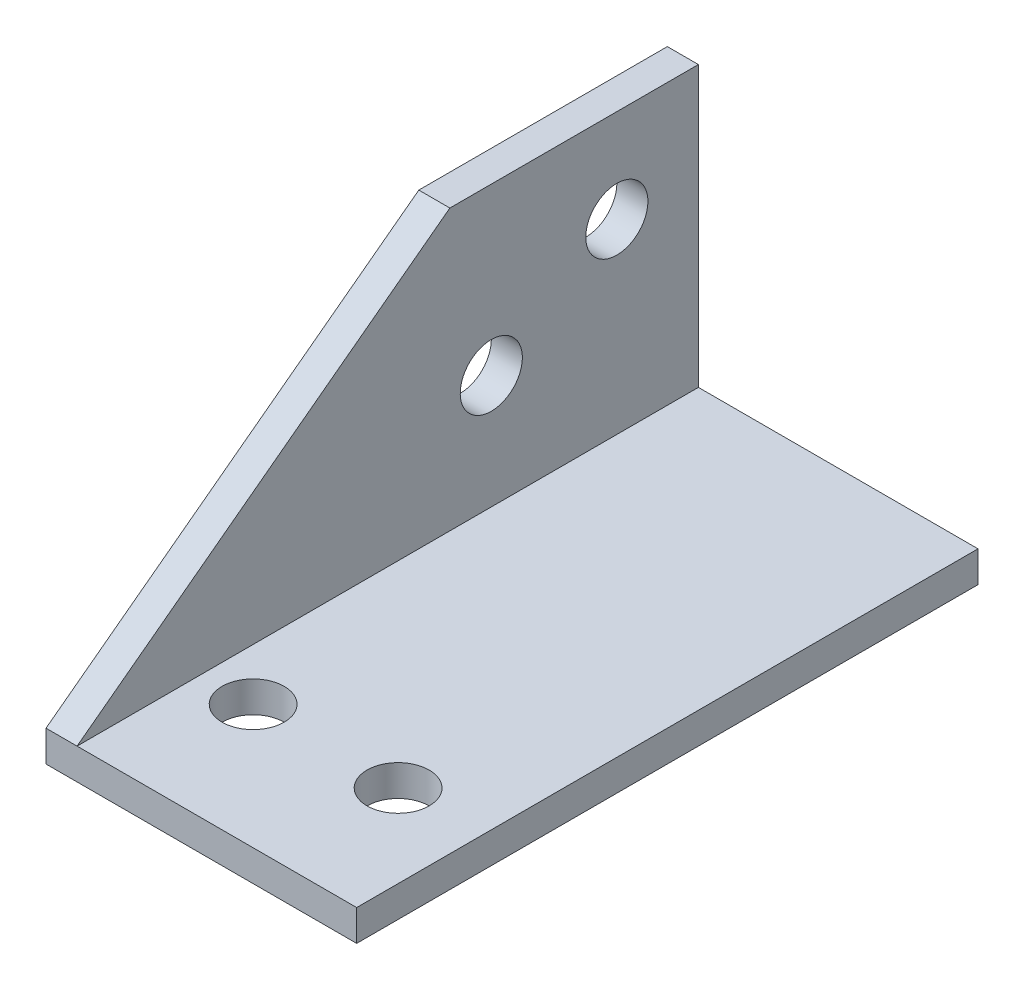
ISO-10303-21;
HEADER;
FILE_DESCRIPTION(('STEP AP214'),'2;1');
FILE_NAME('part.step','',(''),(''),'','','');
FILE_SCHEMA(('AUTOMOTIVE_DESIGN { 1 0 10303 214 1 1 1 1 }'));
ENDSEC;
DATA;
#1=APPLICATION_CONTEXT('core data for automotive mechanical design processes');
#2=APPLICATION_PROTOCOL_DEFINITION('international standard','automotive_design',2000,#1);
#3=PRODUCT_CONTEXT('',#1,'mechanical');
#4=PRODUCT('Part','Part','',(#3));
#5=PRODUCT_RELATED_PRODUCT_CATEGORY('part','',(#4));
#6=PRODUCT_DEFINITION_FORMATION('','',#4);
#7=PRODUCT_DEFINITION_CONTEXT('part definition',#1,'design');
#8=PRODUCT_DEFINITION('design','',#6,#7);
#9=PRODUCT_DEFINITION_SHAPE('','',#8);
#10=(LENGTH_UNIT() NAMED_UNIT(*) SI_UNIT(.MILLI.,.METRE.));
#11=(NAMED_UNIT(*) PLANE_ANGLE_UNIT() SI_UNIT($,.RADIAN.));
#12=(NAMED_UNIT(*) SI_UNIT($,.STERADIAN.) SOLID_ANGLE_UNIT());
#13=UNCERTAINTY_MEASURE_WITH_UNIT(LENGTH_MEASURE(1.E-05),#10,'distance_accuracy_value','');
#14=(GEOMETRIC_REPRESENTATION_CONTEXT(3) GLOBAL_UNCERTAINTY_ASSIGNED_CONTEXT((#13)) GLOBAL_UNIT_ASSIGNED_CONTEXT((#10,
#11,#12)) REPRESENTATION_CONTEXT('',''));
#15=CARTESIAN_POINT('',(0.,0.,0.));
#16=DIRECTION('',(0.,0.,1.));
#17=DIRECTION('',(1.,0.,0.));
#18=AXIS2_PLACEMENT_3D('',#15,#16,#17);
#19=CARTESIAN_POINT('',(-13.9999495377305,-12.8175789473684,30.));
#20=DIRECTION('',(-1.,0.,0.));
#21=DIRECTION('',(0.,-1.,0.));
#22=AXIS2_PLACEMENT_3D('',#19,#20,#21);
#23=PLANE('',#22);
#24=CARTESIAN_POINT('',(-13.9999495377305,-3.81757894736842,3.93782217350893));
#25=DIRECTION('',(1.,0.,0.));
#26=DIRECTION('',(0.,1.,0.));
#27=AXIS2_PLACEMENT_3D('',#24,#25,#26);
#28=CIRCLE('',#27,1.5);
#29=CARTESIAN_POINT('',(-13.9999495377305,-2.31757894736842,3.93782217350893));
#30=VERTEX_POINT('',#29);
#31=EDGE_CURVE('E128',#30,#30,#28,.T.);
#32=ORIENTED_EDGE('',*,*,#31,.F.);
#33=EDGE_LOOP('',(#32));
#34=FACE_BOUND('',#33,.T.);
#35=CARTESIAN_POINT('',(-13.9999495377305,-7.31757894736842,10.));
#36=DIRECTION('',(1.,0.,0.));
#37=DIRECTION('',(0.,1.,0.));
#38=AXIS2_PLACEMENT_3D('',#35,#36,#37);
#39=CIRCLE('',#38,1.5);
#40=CARTESIAN_POINT('',(-13.9999495377305,-5.81757894736842,10.));
#41=VERTEX_POINT('',#40);
#42=EDGE_CURVE('E125',#41,#41,#39,.T.);
#43=ORIENTED_EDGE('',*,*,#42,.F.);
#44=EDGE_LOOP('',(#43));
#45=FACE_BOUND('',#44,.T.);
#46=DIRECTION('',(0.,0.,-1.));
#47=VECTOR('',#46,1.);
#48=CARTESIAN_POINT('',(-13.9999495377305,0.682421052631582,30.));
#49=LINE('',#48,#47);
#50=CARTESIAN_POINT('',(-13.9999495377305,0.682421052631582,12.));
#51=VERTEX_POINT('',#50);
#52=CARTESIAN_POINT('',(-13.9999495377305,0.682421052631582,0.));
#53=VERTEX_POINT('',#52);
#54=EDGE_CURVE('E37',#51,#53,#49,.T.);
#55=ORIENTED_EDGE('',*,*,#54,.F.);
#56=DIRECTION('',(0.,0.6,-0.8));
#57=VECTOR('',#56,1.);
#58=CARTESIAN_POINT('',(-13.9999495377305,-12.8175789473684,30.));
#59=LINE('',#58,#57);
#60=CARTESIAN_POINT('',(-13.9999495377305,-12.8175789473684,30.));
#61=VERTEX_POINT('',#60);
#62=EDGE_CURVE('E93',#61,#51,#59,.T.);
#63=ORIENTED_EDGE('',*,*,#62,.F.);
#64=DIRECTION('',(0.,0.,-1.));
#65=VECTOR('',#64,1.);
#66=CARTESIAN_POINT('',(-13.9999495377305,-12.8175789473684,30.));
#67=LINE('',#66,#65);
#68=CARTESIAN_POINT('',(-13.9999495377305,-12.8175789473684,0.));
#69=VERTEX_POINT('',#68);
#70=EDGE_CURVE('E98',#61,#69,#67,.T.);
#71=ORIENTED_EDGE('',*,*,#70,.T.);
#72=DIRECTION('',(0.,1.,0.));
#73=VECTOR('',#72,1.);
#74=CARTESIAN_POINT('',(-13.9999495377305,-12.8175789473684,0.));
#75=LINE('',#74,#73);
#76=EDGE_CURVE('E151',#69,#53,#75,.T.);
#77=ORIENTED_EDGE('',*,*,#76,.T.);
#78=EDGE_LOOP('',(#55,#63,#71,#77));
#79=FACE_BOUND('',#78,.T.);
#80=ADVANCED_FACE('F30',(#34,#45,#79),#23,.F.);
#81=CARTESIAN_POINT('',(-13.9999495377305,0.682421052631582,30.));
#82=DIRECTION('',(0.,-1.,0.));
#83=DIRECTION('',(0.,0.,-1.));
#84=AXIS2_PLACEMENT_3D('',#81,#82,#83);
#85=PLANE('',#84);
#86=DIRECTION('',(0.,0.,-1.));
#87=VECTOR('',#86,1.);
#88=CARTESIAN_POINT('',(-15.4999495377305,0.682421052631582,30.));
#89=LINE('',#88,#87);
#90=CARTESIAN_POINT('',(-15.4999495377305,0.682421052631582,12.));
#91=VERTEX_POINT('',#90);
#92=CARTESIAN_POINT('',(-15.4999495377305,0.682421052631582,0.));
#93=VERTEX_POINT('',#92);
#94=EDGE_CURVE('E119',#91,#93,#89,.T.);
#95=ORIENTED_EDGE('',*,*,#94,.F.);
#96=DIRECTION('',(1.,0.,0.));
#97=VECTOR('',#96,1.);
#98=CARTESIAN_POINT('',(-63.9999495377305,0.682421052631587,12.));
#99=LINE('',#98,#97);
#100=EDGE_CURVE('E100',#91,#51,#99,.T.);
#101=ORIENTED_EDGE('',*,*,#100,.T.);
#102=ORIENTED_EDGE('',*,*,#54,.T.);
#103=DIRECTION('',(-1.,0.,0.));
#104=VECTOR('',#103,1.);
#105=CARTESIAN_POINT('',(-13.9999495377305,0.682421052631582,0.));
#106=LINE('',#105,#104);
#107=EDGE_CURVE('E157',#53,#93,#106,.T.);
#108=ORIENTED_EDGE('',*,*,#107,.T.);
#109=EDGE_LOOP('',(#95,#101,#102,#108));
#110=FACE_BOUND('',#109,.T.);
#111=ADVANCED_FACE('F175',(#110),#85,.F.);
#112=CARTESIAN_POINT('',(-15.4999495377305,0.682421052631582,30.));
#113=DIRECTION('',(1.,0.,0.));
#114=DIRECTION('',(0.,1.,0.));
#115=AXIS2_PLACEMENT_3D('',#112,#113,#114);
#116=PLANE('',#115);
#117=CARTESIAN_POINT('',(-15.4999495377305,-3.81757894736842,3.93782217350893));
#118=DIRECTION('',(1.,0.,0.));
#119=DIRECTION('',(0.,1.,0.));
#120=AXIS2_PLACEMENT_3D('',#117,#118,#119);
#121=CIRCLE('',#120,1.5);
#122=CARTESIAN_POINT('',(-15.4999495377305,-2.31757894736842,3.93782217350893));
#123=VERTEX_POINT('',#122);
#124=EDGE_CURVE('E126',#123,#123,#121,.T.);
#125=ORIENTED_EDGE('',*,*,#124,.T.);
#126=EDGE_LOOP('',(#125));
#127=FACE_BOUND('',#126,.T.);
#128=CARTESIAN_POINT('',(-15.4999495377305,-7.31757894736842,10.));
#129=DIRECTION('',(1.,0.,0.));
#130=DIRECTION('',(0.,1.,0.));
#131=AXIS2_PLACEMENT_3D('',#128,#129,#130);
#132=CIRCLE('',#131,1.5);
#133=CARTESIAN_POINT('',(-15.4999495377305,-5.81757894736842,10.));
#134=VERTEX_POINT('',#133);
#135=EDGE_CURVE('E122',#134,#134,#132,.T.);
#136=ORIENTED_EDGE('',*,*,#135,.T.);
#137=EDGE_LOOP('',(#136));
#138=FACE_BOUND('',#137,.T.);
#139=DIRECTION('',(0.,-1.,0.));
#140=VECTOR('',#139,1.);
#141=CARTESIAN_POINT('',(-15.4999495377305,0.682421052631582,30.));
#142=LINE('',#141,#140);
#143=CARTESIAN_POINT('',(-15.4999495377305,-12.8175789473684,30.));
#144=VERTEX_POINT('',#143);
#145=CARTESIAN_POINT('',(-15.4999495377305,-14.3175789473684,30.));
#146=VERTEX_POINT('',#145);
#147=EDGE_CURVE('E83',#144,#146,#142,.T.);
#148=ORIENTED_EDGE('',*,*,#147,.F.);
#149=DIRECTION('',(0.,0.6,-0.8));
#150=VECTOR('',#149,1.);
#151=CARTESIAN_POINT('',(-15.4999495377305,-7.95757894736842,23.52));
#152=LINE('',#151,#150);
#153=EDGE_CURVE('E43',#144,#91,#152,.T.);
#154=ORIENTED_EDGE('',*,*,#153,.T.);
#155=ORIENTED_EDGE('',*,*,#94,.T.);
#156=DIRECTION('',(0.,-1.,0.));
#157=VECTOR('',#156,1.);
#158=CARTESIAN_POINT('',(-15.4999495377305,0.682421052631582,0.));
#159=LINE('',#158,#157);
#160=CARTESIAN_POINT('',(-15.4999495377305,-14.3175789473684,0.));
#161=VERTEX_POINT('',#160);
#162=EDGE_CURVE('E160',#93,#161,#159,.T.);
#163=ORIENTED_EDGE('',*,*,#162,.T.);
#164=DIRECTION('',(0.,0.,-1.));
#165=VECTOR('',#164,1.);
#166=CARTESIAN_POINT('',(-15.4999495377305,-14.3175789473684,30.));
#167=LINE('',#166,#165);
#168=EDGE_CURVE('E116',#146,#161,#167,.T.);
#169=ORIENTED_EDGE('',*,*,#168,.F.);
#170=EDGE_LOOP('',(#148,#154,#155,#163,#169));
#171=FACE_BOUND('',#170,.T.);
#172=ADVANCED_FACE('F177',(#127,#138,#171),#116,.F.);
#173=CARTESIAN_POINT('',(-15.4999495377305,-14.3175789473684,30.));
#174=DIRECTION('',(0.,1.,0.));
#175=DIRECTION('',(0.,0.,1.));
#176=AXIS2_PLACEMENT_3D('',#173,#174,#175);
#177=PLANE('',#176);
#178=CARTESIAN_POINT('',(-11.4999495377305,-14.3175789473684,24.));
#179=DIRECTION('',(0.,1.,0.));
#180=DIRECTION('',(0.,0.,1.));
#181=AXIS2_PLACEMENT_3D('',#178,#179,#180);
#182=CIRCLE('',#181,1.5);
#183=CARTESIAN_POINT('',(-11.4999495377305,-14.3175789473684,25.5));
#184=VERTEX_POINT('',#183);
#185=EDGE_CURVE('E142',#184,#184,#182,.T.);
#186=ORIENTED_EDGE('',*,*,#185,.T.);
#187=EDGE_LOOP('',(#186));
#188=FACE_BOUND('',#187,.T.);
#189=CARTESIAN_POINT('',(-4.49994953773048,-14.3175789473684,24.));
#190=DIRECTION('',(0.,1.,0.));
#191=DIRECTION('',(0.,0.,1.));
#192=AXIS2_PLACEMENT_3D('',#189,#190,#191);
#193=CIRCLE('',#192,1.5);
#194=CARTESIAN_POINT('',(-4.49994953773048,-14.3175789473684,25.5));
#195=VERTEX_POINT('',#194);
#196=EDGE_CURVE('E148',#195,#195,#193,.T.);
#197=ORIENTED_EDGE('',*,*,#196,.T.);
#198=EDGE_LOOP('',(#197));
#199=FACE_BOUND('',#198,.T.);
#200=DIRECTION('',(1.,0.,0.));
#201=VECTOR('',#200,1.);
#202=CARTESIAN_POINT('',(-15.4999495377305,-14.3175789473684,0.));
#203=LINE('',#202,#201);
#204=CARTESIAN_POINT('',(-0.499949537730485,-14.3175789473684,0.));
#205=VERTEX_POINT('',#204);
#206=EDGE_CURVE('E162',#161,#205,#203,.T.);
#207=ORIENTED_EDGE('',*,*,#206,.T.);
#208=DIRECTION('',(0.,0.,-1.));
#209=VECTOR('',#208,1.);
#210=CARTESIAN_POINT('',(-0.499949537730485,-14.3175789473684,30.));
#211=LINE('',#210,#209);
#212=CARTESIAN_POINT('',(-0.499949537730485,-14.3175789473684,30.));
#213=VERTEX_POINT('',#212);
#214=EDGE_CURVE('E109',#213,#205,#211,.T.);
#215=ORIENTED_EDGE('',*,*,#214,.F.);
#216=DIRECTION('',(1.,0.,0.));
#217=VECTOR('',#216,1.);
#218=CARTESIAN_POINT('',(-15.4999495377305,-14.3175789473684,30.));
#219=LINE('',#218,#217);
#220=EDGE_CURVE('E153',#146,#213,#219,.T.);
#221=ORIENTED_EDGE('',*,*,#220,.F.);
#222=ORIENTED_EDGE('',*,*,#168,.T.);
#223=EDGE_LOOP('',(#207,#215,#221,#222));
#224=FACE_BOUND('',#223,.T.);
#225=ADVANCED_FACE('F180',(#188,#199,#224),#177,.F.);
#226=CARTESIAN_POINT('',(-0.499949537730485,-14.3175789473684,30.));
#227=DIRECTION('',(-1.,0.,0.));
#228=DIRECTION('',(0.,0.,1.));
#229=AXIS2_PLACEMENT_3D('',#226,#227,#228);
#230=PLANE('',#229);
#231=DIRECTION('',(0.,1.,0.));
#232=VECTOR('',#231,1.);
#233=CARTESIAN_POINT('',(-0.499949537730485,-14.3175789473684,0.));
#234=LINE('',#233,#232);
#235=CARTESIAN_POINT('',(-0.499949537730485,-12.8175789473684,0.));
#236=VERTEX_POINT('',#235);
#237=EDGE_CURVE('E163',#205,#236,#234,.T.);
#238=ORIENTED_EDGE('',*,*,#237,.T.);
#239=DIRECTION('',(0.,0.,-1.));
#240=VECTOR('',#239,1.);
#241=CARTESIAN_POINT('',(-0.499949537730485,-12.8175789473684,30.));
#242=LINE('',#241,#240);
#243=CARTESIAN_POINT('',(-0.499949537730485,-12.8175789473684,30.));
#244=VERTEX_POINT('',#243);
#245=EDGE_CURVE('E107',#244,#236,#242,.T.);
#246=ORIENTED_EDGE('',*,*,#245,.F.);
#247=DIRECTION('',(0.,1.,0.));
#248=VECTOR('',#247,1.);
#249=CARTESIAN_POINT('',(-0.499949537730485,-14.3175789473684,30.));
#250=LINE('',#249,#248);
#251=EDGE_CURVE('E52',#213,#244,#250,.T.);
#252=ORIENTED_EDGE('',*,*,#251,.F.);
#253=ORIENTED_EDGE('',*,*,#214,.T.);
#254=EDGE_LOOP('',(#238,#246,#252,#253));
#255=FACE_BOUND('',#254,.T.);
#256=ADVANCED_FACE('F166',(#255),#230,.F.);
#257=CARTESIAN_POINT('',(-0.499949537730485,-12.8175789473684,30.));
#258=DIRECTION('',(0.,-1.,0.));
#259=DIRECTION('',(1.,0.,0.));
#260=AXIS2_PLACEMENT_3D('',#257,#258,#259);
#261=PLANE('',#260);
#262=CARTESIAN_POINT('',(-11.4999495377305,-12.8175789473684,24.));
#263=DIRECTION('',(0.,1.,0.));
#264=DIRECTION('',(-1.,0.,0.));
#265=AXIS2_PLACEMENT_3D('',#262,#263,#264);
#266=CIRCLE('',#265,1.5);
#267=CARTESIAN_POINT('',(-12.9999495377305,-12.8175789473684,24.));
#268=VERTEX_POINT('',#267);
#269=EDGE_CURVE('E124',#268,#268,#266,.T.);
#270=ORIENTED_EDGE('',*,*,#269,.F.);
#271=EDGE_LOOP('',(#270));
#272=FACE_BOUND('',#271,.T.);
#273=CARTESIAN_POINT('',(-4.49994953773049,-12.8175789473684,24.));
#274=DIRECTION('',(0.,1.,0.));
#275=DIRECTION('',(-1.,0.,0.));
#276=AXIS2_PLACEMENT_3D('',#273,#274,#275);
#277=CIRCLE('',#276,1.5);
#278=CARTESIAN_POINT('',(-5.99994953773049,-12.8175789473684,24.));
#279=VERTEX_POINT('',#278);
#280=EDGE_CURVE('E145',#279,#279,#277,.T.);
#281=ORIENTED_EDGE('',*,*,#280,.F.);
#282=EDGE_LOOP('',(#281));
#283=FACE_BOUND('',#282,.T.);
#284=DIRECTION('',(-1.,0.,0.));
#285=VECTOR('',#284,1.);
#286=CARTESIAN_POINT('',(-0.499949537730485,-12.8175789473684,0.));
#287=LINE('',#286,#285);
#288=EDGE_CURVE('E79',#236,#69,#287,.T.);
#289=ORIENTED_EDGE('',*,*,#288,.T.);
#290=ORIENTED_EDGE('',*,*,#70,.F.);
#291=DIRECTION('',(-1.,0.,0.));
#292=VECTOR('',#291,1.);
#293=CARTESIAN_POINT('',(-0.499949537730485,-12.8175789473684,30.));
#294=LINE('',#293,#292);
#295=EDGE_CURVE('E103',#244,#61,#294,.T.);
#296=ORIENTED_EDGE('',*,*,#295,.F.);
#297=ORIENTED_EDGE('',*,*,#245,.T.);
#298=EDGE_LOOP('',(#289,#290,#296,#297));
#299=FACE_BOUND('',#298,.T.);
#300=ADVANCED_FACE('F106',(#272,#283,#299),#261,.F.);
#301=CARTESIAN_POINT('',(-13.9999495377305,0.682421052631582,30.));
#302=DIRECTION('',(0.,0.,1.));
#303=DIRECTION('',(1.,0.,0.));
#304=AXIS2_PLACEMENT_3D('',#301,#302,#303);
#305=PLANE('',#304);
#306=DIRECTION('',(1.,0.,0.));
#307=VECTOR('',#306,1.);
#308=CARTESIAN_POINT('',(-13.9999495377305,-12.8175789473684,30.));
#309=LINE('',#308,#307);
#310=EDGE_CURVE('E11',#144,#61,#309,.T.);
#311=ORIENTED_EDGE('',*,*,#310,.F.);
#312=ORIENTED_EDGE('',*,*,#147,.T.);
#313=ORIENTED_EDGE('',*,*,#220,.T.);
#314=ORIENTED_EDGE('',*,*,#251,.T.);
#315=ORIENTED_EDGE('',*,*,#295,.T.);
#316=EDGE_LOOP('',(#311,#312,#313,#314,#315));
#317=FACE_BOUND('',#316,.T.);
#318=ADVANCED_FACE('F104',(#317),#305,.T.);
#319=CARTESIAN_POINT('',(-13.9999495377305,0.682421052631582,0.));
#320=DIRECTION('',(0.,0.,1.));
#321=DIRECTION('',(1.,0.,0.));
#322=AXIS2_PLACEMENT_3D('',#319,#320,#321);
#323=PLANE('',#322);
#324=ORIENTED_EDGE('',*,*,#76,.F.);
#325=ORIENTED_EDGE('',*,*,#288,.F.);
#326=ORIENTED_EDGE('',*,*,#237,.F.);
#327=ORIENTED_EDGE('',*,*,#206,.F.);
#328=ORIENTED_EDGE('',*,*,#162,.F.);
#329=ORIENTED_EDGE('',*,*,#107,.F.);
#330=EDGE_LOOP('',(#324,#325,#326,#327,#328,#329));
#331=FACE_BOUND('',#330,.T.);
#332=ADVANCED_FACE('F170',(#331),#323,.F.);
#333=CARTESIAN_POINT('',(-4.49994953773046,-62.8175789473684,24.));
#334=DIRECTION('',(0.,1.,0.));
#335=DIRECTION('',(-1.,0.,0.));
#336=AXIS2_PLACEMENT_3D('',#333,#334,#335);
#337=CYLINDRICAL_SURFACE('',#336,1.5);
#338=ORIENTED_EDGE('',*,*,#280,.T.);
#339=EDGE_LOOP('',(#338));
#340=FACE_BOUND('',#339,.T.);
#341=ORIENTED_EDGE('',*,*,#196,.F.);
#342=EDGE_LOOP('',(#341));
#343=FACE_BOUND('',#342,.T.);
#344=ADVANCED_FACE('F212',(#340,#343),#337,.F.);
#345=CARTESIAN_POINT('',(-11.4999495377305,-62.8175789473684,24.));
#346=DIRECTION('',(0.,1.,0.));
#347=DIRECTION('',(-1.,0.,0.));
#348=AXIS2_PLACEMENT_3D('',#345,#346,#347);
#349=CYLINDRICAL_SURFACE('',#348,1.5);
#350=ORIENTED_EDGE('',*,*,#269,.T.);
#351=EDGE_LOOP('',(#350));
#352=FACE_BOUND('',#351,.T.);
#353=ORIENTED_EDGE('',*,*,#185,.F.);
#354=EDGE_LOOP('',(#353));
#355=FACE_BOUND('',#354,.T.);
#356=ADVANCED_FACE('F203',(#352,#355),#349,.F.);
#357=CARTESIAN_POINT('',(-63.9999495377305,-7.31757894736841,10.));
#358=DIRECTION('',(1.,0.,0.));
#359=DIRECTION('',(0.,1.,0.));
#360=AXIS2_PLACEMENT_3D('',#357,#358,#359);
#361=CYLINDRICAL_SURFACE('',#360,1.5);
#362=ORIENTED_EDGE('',*,*,#42,.T.);
#363=EDGE_LOOP('',(#362));
#364=FACE_BOUND('',#363,.T.);
#365=ORIENTED_EDGE('',*,*,#135,.F.);
#366=EDGE_LOOP('',(#365));
#367=FACE_BOUND('',#366,.T.);
#368=ADVANCED_FACE('F199',(#364,#367),#361,.F.);
#369=CARTESIAN_POINT('',(-63.9999495377305,-3.81757894736841,3.93782217350893));
#370=DIRECTION('',(1.,0.,0.));
#371=DIRECTION('',(0.,1.,0.));
#372=AXIS2_PLACEMENT_3D('',#369,#370,#371);
#373=CYLINDRICAL_SURFACE('',#372,1.5);
#374=ORIENTED_EDGE('',*,*,#31,.T.);
#375=EDGE_LOOP('',(#374));
#376=FACE_BOUND('',#375,.T.);
#377=ORIENTED_EDGE('',*,*,#124,.F.);
#378=EDGE_LOOP('',(#377));
#379=FACE_BOUND('',#378,.T.);
#380=ADVANCED_FACE('F202',(#376,#379),#373,.F.);
#381=CARTESIAN_POINT('',(-63.9999495377305,-12.8175789473684,30.));
#382=DIRECTION('',(0.,-0.8,-0.6));
#383=DIRECTION('',(0.,0.6,-0.8));
#384=AXIS2_PLACEMENT_3D('',#381,#382,#383);
#385=PLANE('',#384);
#386=ORIENTED_EDGE('',*,*,#310,.T.);
#387=ORIENTED_EDGE('',*,*,#62,.T.);
#388=ORIENTED_EDGE('',*,*,#100,.F.);
#389=ORIENTED_EDGE('',*,*,#153,.F.);
#390=EDGE_LOOP('',(#386,#387,#388,#389));
#391=FACE_BOUND('',#390,.T.);
#392=ADVANCED_FACE('F92',(#391),#385,.F.);
#393=CLOSED_SHELL('',(#80,#111,#172,#225,#256,#300,#318,#332,#344,#356,#368,#380,#392));
#394=MANIFOLD_SOLID_BREP('B2',#393);
#395=ADVANCED_BREP_SHAPE_REPRESENTATION('',(#18,#394),#14);
#396=SHAPE_DEFINITION_REPRESENTATION(#9,#395);
ENDSEC;
END-ISO-10303-21;
